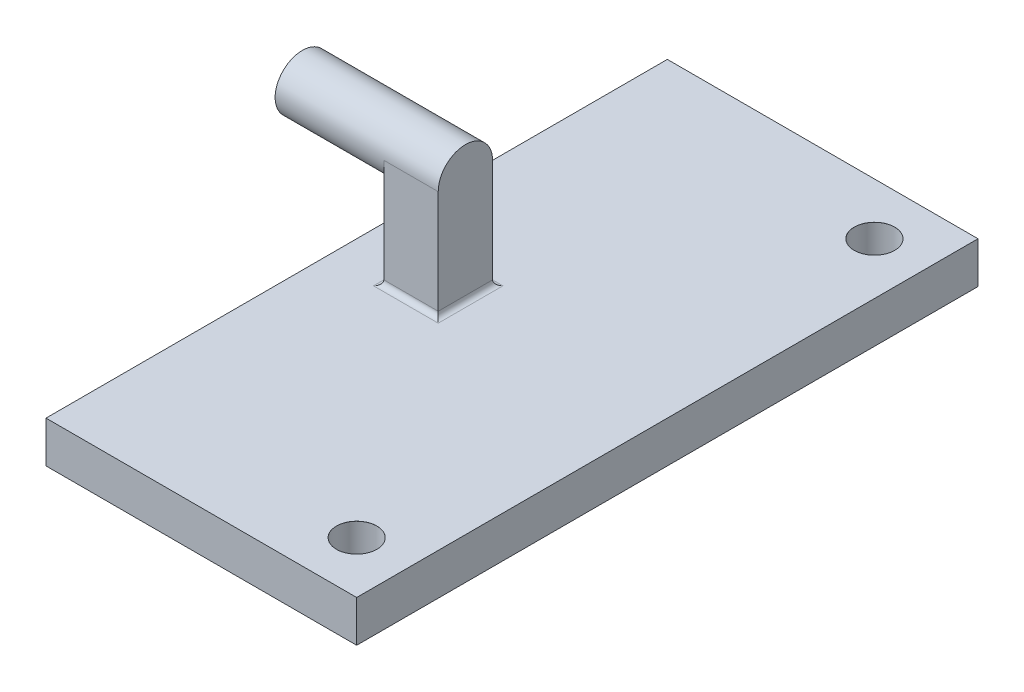
ISO-10303-21;
HEADER;
FILE_DESCRIPTION(('STEP AP214'),'2;1');
FILE_NAME('part.step','',(''),(''),'','','');
FILE_SCHEMA(('AUTOMOTIVE_DESIGN { 1 0 10303 214 1 1 1 1 }'));
ENDSEC;
DATA;
#1=APPLICATION_CONTEXT('core data for automotive mechanical design processes');
#2=APPLICATION_PROTOCOL_DEFINITION('international standard','automotive_design',2000,#1);
#3=PRODUCT_CONTEXT('',#1,'mechanical');
#4=PRODUCT('Part','Part','',(#3));
#5=PRODUCT_RELATED_PRODUCT_CATEGORY('part','',(#4));
#6=PRODUCT_DEFINITION_FORMATION('','',#4);
#7=PRODUCT_DEFINITION_CONTEXT('part definition',#1,'design');
#8=PRODUCT_DEFINITION('design','',#6,#7);
#9=PRODUCT_DEFINITION_SHAPE('','',#8);
#10=(LENGTH_UNIT() NAMED_UNIT(*) SI_UNIT(.MILLI.,.METRE.));
#11=(NAMED_UNIT(*) PLANE_ANGLE_UNIT() SI_UNIT($,.RADIAN.));
#12=(NAMED_UNIT(*) SI_UNIT($,.STERADIAN.) SOLID_ANGLE_UNIT());
#13=UNCERTAINTY_MEASURE_WITH_UNIT(LENGTH_MEASURE(1.E-05),#10,'distance_accuracy_value','');
#14=(GEOMETRIC_REPRESENTATION_CONTEXT(3) GLOBAL_UNCERTAINTY_ASSIGNED_CONTEXT((#13)) GLOBAL_UNIT_ASSIGNED_CONTEXT((#10,
#11,#12)) REPRESENTATION_CONTEXT('',''));
#15=CARTESIAN_POINT('',(0.,0.,0.));
#16=DIRECTION('',(0.,0.,1.));
#17=DIRECTION('',(1.,0.,0.));
#18=AXIS2_PLACEMENT_3D('',#15,#16,#17);
#19=CARTESIAN_POINT('',(105.,0.,0.));
#20=DIRECTION('',(-1.,0.,0.));
#21=DIRECTION('',(0.,0.,1.));
#22=AXIS2_PLACEMENT_3D('',#19,#20,#21);
#23=CYLINDRICAL_SURFACE('',#22,26.25);
#24=CARTESIAN_POINT('',(105.,0.,0.));
#25=DIRECTION('',(1.,0.,0.));
#26=DIRECTION('',(0.,0.,-1.));
#27=AXIS2_PLACEMENT_3D('',#24,#25,#26);
#28=CIRCLE('',#27,26.25);
#29=CARTESIAN_POINT('',(105.,0.,26.25));
#30=VERTEX_POINT('',#29);
#31=CARTESIAN_POINT('',(105.,0.,-26.25));
#32=VERTEX_POINT('',#31);
#33=EDGE_CURVE('E223',#30,#32,#28,.T.);
#34=ORIENTED_EDGE('',*,*,#33,.F.);
#35=DIRECTION('',(-1.,0.,0.));
#36=VECTOR('',#35,1.);
#37=CARTESIAN_POINT('',(157.5,0.,26.25));
#38=LINE('',#37,#36);
#39=CARTESIAN_POINT('',(157.5,0.,26.25));
#40=VERTEX_POINT('',#39);
#41=EDGE_CURVE('E218',#40,#30,#38,.T.);
#42=ORIENTED_EDGE('',*,*,#41,.F.);
#43=CARTESIAN_POINT('',(157.5,0.,0.));
#44=DIRECTION('',(1.,0.,0.));
#45=DIRECTION('',(0.,0.,1.));
#46=AXIS2_PLACEMENT_3D('',#43,#44,#45);
#47=CIRCLE('',#46,26.25);
#48=CARTESIAN_POINT('',(157.5,0.,-26.25));
#49=VERTEX_POINT('',#48);
#50=EDGE_CURVE('E198',#49,#40,#47,.T.);
#51=ORIENTED_EDGE('',*,*,#50,.F.);
#52=DIRECTION('',(-1.,0.,0.));
#53=VECTOR('',#52,1.);
#54=CARTESIAN_POINT('',(157.5,0.,-26.25));
#55=LINE('',#54,#53);
#56=EDGE_CURVE('E210',#49,#32,#55,.T.);
#57=ORIENTED_EDGE('',*,*,#56,.T.);
#58=EDGE_LOOP('',(#34,#42,#51,#57));
#59=FACE_BOUND('',#58,.T.);
#60=CARTESIAN_POINT('',(0.,0.,0.));
#61=DIRECTION('',(1.,0.,0.));
#62=DIRECTION('',(0.,0.,-1.));
#63=AXIS2_PLACEMENT_3D('',#60,#61,#62);
#64=CIRCLE('',#63,26.25);
#65=CARTESIAN_POINT('',(0.,0.,-26.25));
#66=VERTEX_POINT('',#65);
#67=EDGE_CURVE('E222',#66,#66,#64,.T.);
#68=ORIENTED_EDGE('',*,*,#67,.T.);
#69=EDGE_LOOP('',(#68));
#70=FACE_BOUND('',#69,.T.);
#71=ADVANCED_FACE('F45',(#59,#70),#23,.T.);
#72=CARTESIAN_POINT('',(0.,0.,0.));
#73=DIRECTION('',(1.,0.,0.));
#74=DIRECTION('',(0.,0.,-1.));
#75=AXIS2_PLACEMENT_3D('',#72,#73,#74);
#76=PLANE('',#75);
#77=CARTESIAN_POINT('',(0.,0.,0.));
#78=DIRECTION('',(-1.,0.,0.));
#79=DIRECTION('',(0.,0.,1.));
#80=AXIS2_PLACEMENT_3D('',#77,#78,#79);
#81=CIRCLE('',#80,11.025);
#82=CARTESIAN_POINT('',(0.,0.,11.025));
#83=VERTEX_POINT('',#82);
#84=EDGE_CURVE('E180',#83,#83,#81,.T.);
#85=ORIENTED_EDGE('',*,*,#84,.F.);
#86=EDGE_LOOP('',(#85));
#87=FACE_BOUND('',#86,.T.);
#88=ORIENTED_EDGE('',*,*,#67,.F.);
#89=EDGE_LOOP('',(#88));
#90=FACE_BOUND('',#89,.T.);
#91=ADVANCED_FACE('F306',(#87,#90),#76,.F.);
#92=CARTESIAN_POINT('',(157.5,0.,26.25));
#93=DIRECTION('',(0.,0.,-1.));
#94=DIRECTION('',(-1.,0.,0.));
#95=AXIS2_PLACEMENT_3D('',#92,#93,#94);
#96=PLANE('',#95);
#97=DIRECTION('',(0.,-1.,0.));
#98=VECTOR('',#97,1.);
#99=CARTESIAN_POINT('',(105.,0.,26.25));
#100=LINE('',#99,#98);
#101=CARTESIAN_POINT('',(105.,-100.,26.25));
#102=VERTEX_POINT('',#101);
#103=EDGE_CURVE('E197',#30,#102,#100,.T.);
#104=ORIENTED_EDGE('',*,*,#103,.T.);
#105=DIRECTION('',(-1.,0.,0.));
#106=VECTOR('',#105,1.);
#107=CARTESIAN_POINT('',(157.5,-100.,26.25));
#108=LINE('',#107,#106);
#109=CARTESIAN_POINT('',(157.5,-100.,26.25));
#110=VERTEX_POINT('',#109);
#111=EDGE_CURVE('E11',#102,#110,#108,.F.);
#112=ORIENTED_EDGE('',*,*,#111,.T.);
#113=DIRECTION('',(0.,-1.,0.));
#114=VECTOR('',#113,1.);
#115=CARTESIAN_POINT('',(157.5,0.,26.25));
#116=LINE('',#115,#114);
#117=EDGE_CURVE('E202',#40,#110,#116,.T.);
#118=ORIENTED_EDGE('',*,*,#117,.F.);
#119=ORIENTED_EDGE('',*,*,#41,.T.);
#120=EDGE_LOOP('',(#104,#112,#118,#119));
#121=FACE_BOUND('',#120,.T.);
#122=ADVANCED_FACE('F290',(#121),#96,.F.);
#123=CARTESIAN_POINT('',(157.5,-105.,-26.25));
#124=DIRECTION('',(0.,0.,1.));
#125=DIRECTION('',(1.,0.,0.));
#126=AXIS2_PLACEMENT_3D('',#123,#124,#125);
#127=PLANE('',#126);
#128=DIRECTION('',(0.,1.,0.));
#129=VECTOR('',#128,1.);
#130=CARTESIAN_POINT('',(157.5,-105.,-26.25));
#131=LINE('',#130,#129);
#132=CARTESIAN_POINT('',(157.5,-100.,-26.25));
#133=VERTEX_POINT('',#132);
#134=EDGE_CURVE('E207',#133,#49,#131,.T.);
#135=ORIENTED_EDGE('',*,*,#134,.F.);
#136=DIRECTION('',(-1.,0.,0.));
#137=VECTOR('',#136,1.);
#138=CARTESIAN_POINT('',(157.5,-100.,-26.25));
#139=LINE('',#138,#137);
#140=CARTESIAN_POINT('',(105.,-100.,-26.25));
#141=VERTEX_POINT('',#140);
#142=EDGE_CURVE('E70',#133,#141,#139,.T.);
#143=ORIENTED_EDGE('',*,*,#142,.T.);
#144=DIRECTION('',(0.,1.,0.));
#145=VECTOR('',#144,1.);
#146=CARTESIAN_POINT('',(105.,-105.,-26.25));
#147=LINE('',#146,#145);
#148=EDGE_CURVE('E203',#141,#32,#147,.T.);
#149=ORIENTED_EDGE('',*,*,#148,.T.);
#150=ORIENTED_EDGE('',*,*,#56,.F.);
#151=EDGE_LOOP('',(#135,#143,#149,#150));
#152=FACE_BOUND('',#151,.T.);
#153=ADVANCED_FACE('F284',(#152),#127,.F.);
#154=CARTESIAN_POINT('',(157.5,0.,0.));
#155=DIRECTION('',(-1.,0.,0.));
#156=DIRECTION('',(0.,0.,1.));
#157=AXIS2_PLACEMENT_3D('',#154,#155,#156);
#158=PLANE('',#157);
#159=ORIENTED_EDGE('',*,*,#117,.T.);
#160=DIRECTION('',(0.,0.,-1.));
#161=VECTOR('',#160,1.);
#162=CARTESIAN_POINT('',(157.5,-100.,0.));
#163=LINE('',#162,#161);
#164=EDGE_CURVE('E227',#110,#133,#163,.T.);
#165=ORIENTED_EDGE('',*,*,#164,.T.);
#166=ORIENTED_EDGE('',*,*,#134,.T.);
#167=ORIENTED_EDGE('',*,*,#50,.T.);
#168=EDGE_LOOP('',(#159,#165,#166,#167));
#169=FACE_BOUND('',#168,.T.);
#170=ADVANCED_FACE('F282',(#169),#158,.F.);
#171=CARTESIAN_POINT('',(105.,0.,0.));
#172=DIRECTION('',(-1.,0.,0.));
#173=DIRECTION('',(0.,0.,1.));
#174=AXIS2_PLACEMENT_3D('',#171,#172,#173);
#175=PLANE('',#174);
#176=ORIENTED_EDGE('',*,*,#148,.F.);
#177=DIRECTION('',(0.,0.,-1.));
#178=VECTOR('',#177,1.);
#179=CARTESIAN_POINT('',(105.,-100.,26.25));
#180=LINE('',#179,#178);
#181=EDGE_CURVE('E55',#141,#102,#180,.F.);
#182=ORIENTED_EDGE('',*,*,#181,.T.);
#183=ORIENTED_EDGE('',*,*,#103,.F.);
#184=ORIENTED_EDGE('',*,*,#33,.T.);
#185=EDGE_LOOP('',(#176,#182,#183,#184));
#186=FACE_BOUND('',#185,.T.);
#187=ADVANCED_FACE('F291',(#186),#175,.T.);
#188=CARTESIAN_POINT('',(105.,0.,0.));
#189=DIRECTION('',(-1.,0.,0.));
#190=DIRECTION('',(0.,0.,1.));
#191=AXIS2_PLACEMENT_3D('',#188,#189,#190);
#192=CONICAL_SURFACE('',#191,11.,1.02974425867665);
#193=CARTESIAN_POINT('',(111.609466809303,0.,0.));
#194=VERTEX_POINT('',#193);
#195=VERTEX_LOOP('',#194);
#196=FACE_BOUND('',#195,.T.);
#197=CARTESIAN_POINT('',(105.,0.,0.));
#198=DIRECTION('',(-1.,0.,0.));
#199=DIRECTION('',(0.,0.,1.));
#200=AXIS2_PLACEMENT_3D('',#197,#198,#199);
#201=CIRCLE('',#200,11.);
#202=CARTESIAN_POINT('',(105.,0.,11.));
#203=VERTEX_POINT('',#202);
#204=EDGE_CURVE('E193',#203,#203,#201,.T.);
#205=ORIENTED_EDGE('',*,*,#204,.T.);
#206=EDGE_LOOP('',(#205));
#207=FACE_BOUND('',#206,.T.);
#208=ADVANCED_FACE('F293',(#196,#207),#192,.F.);
#209=CARTESIAN_POINT('',(0.,0.,0.));
#210=DIRECTION('',(-1.,0.,0.));
#211=DIRECTION('',(0.,0.,1.));
#212=AXIS2_PLACEMENT_3D('',#209,#210,#211);
#213=CYLINDRICAL_SURFACE('',#212,11.);
#214=ORIENTED_EDGE('',*,*,#204,.F.);
#215=EDGE_LOOP('',(#214));
#216=FACE_BOUND('',#215,.T.);
#217=CARTESIAN_POINT('',(0.0249999999999972,0.,0.));
#218=DIRECTION('',(-1.,0.,0.));
#219=DIRECTION('',(0.,0.,1.));
#220=AXIS2_PLACEMENT_3D('',#217,#218,#219);
#221=CIRCLE('',#220,11.);
#222=CARTESIAN_POINT('',(0.0249999999999972,0.,11.));
#223=VERTEX_POINT('',#222);
#224=EDGE_CURVE('E189',#223,#223,#221,.T.);
#225=ORIENTED_EDGE('',*,*,#224,.T.);
#226=EDGE_LOOP('',(#225));
#227=FACE_BOUND('',#226,.T.);
#228=ADVANCED_FACE('F300',(#216,#227),#213,.F.);
#229=CARTESIAN_POINT('',(0.,0.,0.));
#230=DIRECTION('',(-1.,0.,0.));
#231=DIRECTION('',(0.,0.,1.));
#232=AXIS2_PLACEMENT_3D('',#229,#230,#231);
#233=CONICAL_SURFACE('',#232,11.025,0.785398163397882);
#234=ORIENTED_EDGE('',*,*,#224,.F.);
#235=EDGE_LOOP('',(#234));
#236=FACE_BOUND('',#235,.T.);
#237=ORIENTED_EDGE('',*,*,#84,.T.);
#238=EDGE_LOOP('',(#237));
#239=FACE_BOUND('',#238,.T.);
#240=ADVANCED_FACE('F340',(#236,#239),#233,.F.);
#241=CARTESIAN_POINT('',(52.5,-145.,0.));
#242=DIRECTION('',(1.,0.,0.));
#243=DIRECTION('',(0.,0.,-1.));
#244=AXIS2_PLACEMENT_3D('',#241,#242,#243);
#245=PLANE('',#244);
#246=DIRECTION('',(0.,0.,-1.));
#247=VECTOR('',#246,1.);
#248=CARTESIAN_POINT('',(52.5,-105.,0.));
#249=LINE('',#248,#247);
#250=CARTESIAN_POINT('',(52.5,-105.,300.));
#251=VERTEX_POINT('',#250);
#252=CARTESIAN_POINT('',(52.5000000000002,-105.,-300.));
#253=VERTEX_POINT('',#252);
#254=EDGE_CURVE('E156',#251,#253,#249,.T.);
#255=ORIENTED_EDGE('',*,*,#254,.T.);
#256=DIRECTION('',(0.,1.,0.));
#257=VECTOR('',#256,1.);
#258=CARTESIAN_POINT('',(52.5000000000002,-145.,-300.));
#259=LINE('',#258,#257);
#260=CARTESIAN_POINT('',(52.5000000000002,-145.,-300.));
#261=VERTEX_POINT('',#260);
#262=EDGE_CURVE('E153',#261,#253,#259,.T.);
#263=ORIENTED_EDGE('',*,*,#262,.F.);
#264=DIRECTION('',(0.,0.,1.));
#265=VECTOR('',#264,1.);
#266=CARTESIAN_POINT('',(52.5,-145.,0.));
#267=LINE('',#266,#265);
#268=CARTESIAN_POINT('',(52.5,-145.,300.));
#269=VERTEX_POINT('',#268);
#270=EDGE_CURVE('E146',#261,#269,#267,.T.);
#271=ORIENTED_EDGE('',*,*,#270,.T.);
#272=DIRECTION('',(0.,1.,0.));
#273=VECTOR('',#272,1.);
#274=CARTESIAN_POINT('',(52.5,-145.,300.));
#275=LINE('',#274,#273);
#276=EDGE_CURVE('E129',#269,#251,#275,.T.);
#277=ORIENTED_EDGE('',*,*,#276,.T.);
#278=EDGE_LOOP('',(#255,#263,#271,#277));
#279=FACE_BOUND('',#278,.T.);
#280=ADVANCED_FACE('F152',(#279),#245,.F.);
#281=CARTESIAN_POINT('',(352.5,-145.,-300.));
#282=DIRECTION('',(0.,0.,-1.));
#283=DIRECTION('',(-1.,0.,0.));
#284=AXIS2_PLACEMENT_3D('',#281,#282,#283);
#285=PLANE('',#284);
#286=DIRECTION('',(-1.,0.,0.));
#287=VECTOR('',#286,1.);
#288=CARTESIAN_POINT('',(352.5,-105.,-300.));
#289=LINE('',#288,#287);
#290=CARTESIAN_POINT('',(352.5,-105.,-300.));
#291=VERTEX_POINT('',#290);
#292=EDGE_CURVE('E159',#291,#253,#289,.T.);
#293=ORIENTED_EDGE('',*,*,#292,.F.);
#294=DIRECTION('',(0.,1.,0.));
#295=VECTOR('',#294,1.);
#296=CARTESIAN_POINT('',(352.5,-145.,-300.));
#297=LINE('',#296,#295);
#298=CARTESIAN_POINT('',(352.5,-145.,-300.));
#299=VERTEX_POINT('',#298);
#300=EDGE_CURVE('E181',#299,#291,#297,.T.);
#301=ORIENTED_EDGE('',*,*,#300,.F.);
#302=DIRECTION('',(-1.,0.,0.));
#303=VECTOR('',#302,1.);
#304=CARTESIAN_POINT('',(352.5,-145.,-300.));
#305=LINE('',#304,#303);
#306=EDGE_CURVE('E140',#299,#261,#305,.T.);
#307=ORIENTED_EDGE('',*,*,#306,.T.);
#308=ORIENTED_EDGE('',*,*,#262,.T.);
#309=EDGE_LOOP('',(#293,#301,#307,#308));
#310=FACE_BOUND('',#309,.T.);
#311=ADVANCED_FACE('F339',(#310),#285,.T.);
#312=CARTESIAN_POINT('',(352.5,-145.,300.));
#313=DIRECTION('',(1.,0.,0.));
#314=DIRECTION('',(0.,0.,-1.));
#315=AXIS2_PLACEMENT_3D('',#312,#313,#314);
#316=PLANE('',#315);
#317=DIRECTION('',(0.,0.,-1.));
#318=VECTOR('',#317,1.);
#319=CARTESIAN_POINT('',(352.5,-105.,300.));
#320=LINE('',#319,#318);
#321=CARTESIAN_POINT('',(352.5,-105.,300.));
#322=VERTEX_POINT('',#321);
#323=EDGE_CURVE('E171',#322,#291,#320,.T.);
#324=ORIENTED_EDGE('',*,*,#323,.F.);
#325=DIRECTION('',(0.,1.,0.));
#326=VECTOR('',#325,1.);
#327=CARTESIAN_POINT('',(352.5,-145.,300.));
#328=LINE('',#327,#326);
#329=CARTESIAN_POINT('',(352.5,-145.,300.));
#330=VERTEX_POINT('',#329);
#331=EDGE_CURVE('E139',#330,#322,#328,.T.);
#332=ORIENTED_EDGE('',*,*,#331,.F.);
#333=DIRECTION('',(0.,0.,-1.));
#334=VECTOR('',#333,1.);
#335=CARTESIAN_POINT('',(352.5,-145.,300.));
#336=LINE('',#335,#334);
#337=EDGE_CURVE('E149',#330,#299,#336,.T.);
#338=ORIENTED_EDGE('',*,*,#337,.T.);
#339=ORIENTED_EDGE('',*,*,#300,.T.);
#340=EDGE_LOOP('',(#324,#332,#338,#339));
#341=FACE_BOUND('',#340,.T.);
#342=ADVANCED_FACE('F343',(#341),#316,.T.);
#343=CARTESIAN_POINT('',(52.5,-145.,300.));
#344=DIRECTION('',(0.,0.,1.));
#345=DIRECTION('',(1.,0.,0.));
#346=AXIS2_PLACEMENT_3D('',#343,#344,#345);
#347=PLANE('',#346);
#348=DIRECTION('',(1.,0.,0.));
#349=VECTOR('',#348,1.);
#350=CARTESIAN_POINT('',(52.5,-105.,300.));
#351=LINE('',#350,#349);
#352=EDGE_CURVE('E134',#251,#322,#351,.T.);
#353=ORIENTED_EDGE('',*,*,#352,.F.);
#354=ORIENTED_EDGE('',*,*,#276,.F.);
#355=DIRECTION('',(1.,0.,0.));
#356=VECTOR('',#355,1.);
#357=CARTESIAN_POINT('',(52.5,-145.,300.));
#358=LINE('',#357,#356);
#359=EDGE_CURVE('E132',#269,#330,#358,.T.);
#360=ORIENTED_EDGE('',*,*,#359,.T.);
#361=ORIENTED_EDGE('',*,*,#331,.T.);
#362=EDGE_LOOP('',(#353,#354,#360,#361));
#363=FACE_BOUND('',#362,.T.);
#364=ADVANCED_FACE('F131',(#363),#347,.T.);
#365=CARTESIAN_POINT('',(0.,-145.,0.));
#366=DIRECTION('',(0.,1.,0.));
#367=DIRECTION('',(0.,0.,1.));
#368=AXIS2_PLACEMENT_3D('',#365,#366,#367);
#369=PLANE('',#368);
#370=CARTESIAN_POINT('',(302.5,-145.,250.));
#371=DIRECTION('',(0.,1.,0.));
#372=DIRECTION('',(0.,0.,1.));
#373=AXIS2_PLACEMENT_3D('',#370,#371,#372);
#374=CIRCLE('',#373,19.5);
#375=CARTESIAN_POINT('',(302.5,-145.,269.5));
#376=VERTEX_POINT('',#375);
#377=EDGE_CURVE('E503',#376,#376,#374,.T.);
#378=ORIENTED_EDGE('',*,*,#377,.T.);
#379=EDGE_LOOP('',(#378));
#380=FACE_BOUND('',#379,.T.);
#381=CARTESIAN_POINT('',(302.5,-145.,-250.));
#382=DIRECTION('',(0.,1.,0.));
#383=DIRECTION('',(0.,0.,1.));
#384=AXIS2_PLACEMENT_3D('',#381,#382,#383);
#385=CIRCLE('',#384,19.5);
#386=CARTESIAN_POINT('',(302.5,-145.,-230.5));
#387=VERTEX_POINT('',#386);
#388=EDGE_CURVE('E162',#387,#387,#385,.T.);
#389=ORIENTED_EDGE('',*,*,#388,.T.);
#390=EDGE_LOOP('',(#389));
#391=FACE_BOUND('',#390,.T.);
#392=ORIENTED_EDGE('',*,*,#270,.F.);
#393=ORIENTED_EDGE('',*,*,#306,.F.);
#394=ORIENTED_EDGE('',*,*,#337,.F.);
#395=ORIENTED_EDGE('',*,*,#359,.F.);
#396=EDGE_LOOP('',(#392,#393,#394,#395));
#397=FACE_BOUND('',#396,.T.);
#398=ADVANCED_FACE('F144',(#380,#391,#397),#369,.F.);
#399=CARTESIAN_POINT('',(0.,-105.,0.));
#400=DIRECTION('',(0.,1.,0.));
#401=DIRECTION('',(0.,0.,1.));
#402=AXIS2_PLACEMENT_3D('',#399,#400,#401);
#403=PLANE('',#402);
#404=CARTESIAN_POINT('',(302.5,-105.,250.));
#405=DIRECTION('',(0.,1.,0.));
#406=DIRECTION('',(0.,0.,1.));
#407=AXIS2_PLACEMENT_3D('',#404,#405,#406);
#408=CIRCLE('',#407,19.525);
#409=CARTESIAN_POINT('',(302.5,-105.,269.525));
#410=VERTEX_POINT('',#409);
#411=EDGE_CURVE('E499',#410,#410,#408,.T.);
#412=ORIENTED_EDGE('',*,*,#411,.F.);
#413=EDGE_LOOP('',(#412));
#414=FACE_BOUND('',#413,.T.);
#415=CARTESIAN_POINT('',(302.5,-105.,-250.));
#416=DIRECTION('',(0.,1.,0.));
#417=DIRECTION('',(0.,0.,1.));
#418=AXIS2_PLACEMENT_3D('',#415,#416,#417);
#419=CIRCLE('',#418,19.525);
#420=CARTESIAN_POINT('',(302.5,-105.,-230.475));
#421=VERTEX_POINT('',#420);
#422=EDGE_CURVE('E509',#421,#421,#419,.T.);
#423=ORIENTED_EDGE('',*,*,#422,.F.);
#424=EDGE_LOOP('',(#423));
#425=FACE_BOUND('',#424,.T.);
#426=DIRECTION('',(-1.,0.,0.));
#427=VECTOR('',#426,1.);
#428=CARTESIAN_POINT('',(0.,-105.,-31.25));
#429=LINE('',#428,#427);
#430=CARTESIAN_POINT('',(100.,-105.,-31.25));
#431=VERTEX_POINT('',#430);
#432=CARTESIAN_POINT('',(162.5,-105.,-31.25));
#433=VERTEX_POINT('',#432);
#434=EDGE_CURVE('E240',#431,#433,#429,.F.);
#435=ORIENTED_EDGE('',*,*,#434,.T.);
#436=DIRECTION('',(0.,0.,-1.));
#437=VECTOR('',#436,1.);
#438=CARTESIAN_POINT('',(162.5,-105.,0.));
#439=LINE('',#438,#437);
#440=CARTESIAN_POINT('',(162.5,-105.,31.25));
#441=VERTEX_POINT('',#440);
#442=EDGE_CURVE('E243',#433,#441,#439,.F.);
#443=ORIENTED_EDGE('',*,*,#442,.T.);
#444=DIRECTION('',(-1.,0.,0.));
#445=VECTOR('',#444,1.);
#446=CARTESIAN_POINT('',(0.,-105.,31.25));
#447=LINE('',#446,#445);
#448=CARTESIAN_POINT('',(100.,-105.,31.25));
#449=VERTEX_POINT('',#448);
#450=EDGE_CURVE('E234',#441,#449,#447,.T.);
#451=ORIENTED_EDGE('',*,*,#450,.T.);
#452=DIRECTION('',(0.,0.,-1.));
#453=VECTOR('',#452,1.);
#454=CARTESIAN_POINT('',(100.,-105.,-26.25));
#455=LINE('',#454,#453);
#456=EDGE_CURVE('E237',#449,#431,#455,.T.);
#457=ORIENTED_EDGE('',*,*,#456,.T.);
#458=EDGE_LOOP('',(#435,#443,#451,#457));
#459=FACE_BOUND('',#458,.T.);
#460=ORIENTED_EDGE('',*,*,#254,.F.);
#461=ORIENTED_EDGE('',*,*,#352,.T.);
#462=ORIENTED_EDGE('',*,*,#323,.T.);
#463=ORIENTED_EDGE('',*,*,#292,.T.);
#464=EDGE_LOOP('',(#460,#461,#462,#463));
#465=FACE_BOUND('',#464,.T.);
#466=ADVANCED_FACE('F273',(#414,#425,#459,#465),#403,.T.);
#467=CARTESIAN_POINT('',(100.,-100.,0.));
#468=DIRECTION('',(0.,0.,1.));
#469=DIRECTION('',(1.,0.,0.));
#470=AXIS2_PLACEMENT_3D('',#467,#468,#469);
#471=CYLINDRICAL_SURFACE('',#470,5.);
#472=CARTESIAN_POINT('',(100.,-100.,-31.25));
#473=DIRECTION('',(-0.707106781186547,0.,0.707106781186547));
#474=DIRECTION('',(0.707106781186547,0.,0.707106781186547));
#475=AXIS2_PLACEMENT_3D('',#472,#473,#474);
#476=ELLIPSE('',#475,7.07106781186547,5.);
#477=EDGE_CURVE('E256',#431,#141,#476,.T.);
#478=ORIENTED_EDGE('',*,*,#477,.F.);
#479=ORIENTED_EDGE('',*,*,#456,.F.);
#480=CARTESIAN_POINT('',(100.,-100.,31.25));
#481=DIRECTION('',(-0.707106781186547,0.,-0.707106781186547));
#482=DIRECTION('',(-0.707106781186547,0.,0.707106781186547));
#483=AXIS2_PLACEMENT_3D('',#480,#481,#482);
#484=ELLIPSE('',#483,7.07106781186547,5.);
#485=EDGE_CURVE('E49',#102,#449,#484,.T.);
#486=ORIENTED_EDGE('',*,*,#485,.F.);
#487=ORIENTED_EDGE('',*,*,#181,.F.);
#488=EDGE_LOOP('',(#478,#479,#486,#487));
#489=FACE_BOUND('',#488,.T.);
#490=ADVANCED_FACE('F47',(#489),#471,.F.);
#491=CARTESIAN_POINT('',(0.,-100.,31.25));
#492=DIRECTION('',(-1.,0.,0.));
#493=DIRECTION('',(0.,0.,1.));
#494=AXIS2_PLACEMENT_3D('',#491,#492,#493);
#495=CYLINDRICAL_SURFACE('',#494,5.);
#496=ORIENTED_EDGE('',*,*,#485,.T.);
#497=ORIENTED_EDGE('',*,*,#450,.F.);
#498=CARTESIAN_POINT('',(162.5,-100.,31.25));
#499=DIRECTION('',(-0.707106781186547,0.,0.707106781186547));
#500=DIRECTION('',(-0.707106781186547,0.,-0.707106781186547));
#501=AXIS2_PLACEMENT_3D('',#498,#499,#500);
#502=ELLIPSE('',#501,7.07106781186547,5.);
#503=EDGE_CURVE('E254',#110,#441,#502,.T.);
#504=ORIENTED_EDGE('',*,*,#503,.F.);
#505=ORIENTED_EDGE('',*,*,#111,.F.);
#506=EDGE_LOOP('',(#496,#497,#504,#505));
#507=FACE_BOUND('',#506,.T.);
#508=ADVANCED_FACE('F268',(#507),#495,.F.);
#509=CARTESIAN_POINT('',(157.5,-100.,-31.25));
#510=DIRECTION('',(-1.,0.,0.));
#511=DIRECTION('',(0.,0.,1.));
#512=AXIS2_PLACEMENT_3D('',#509,#510,#511);
#513=CYLINDRICAL_SURFACE('',#512,5.);
#514=ORIENTED_EDGE('',*,*,#477,.T.);
#515=ORIENTED_EDGE('',*,*,#142,.F.);
#516=CARTESIAN_POINT('',(162.5,-100.,-31.25));
#517=DIRECTION('',(-0.707106781186547,0.,-0.707106781186547));
#518=DIRECTION('',(-0.707106781186547,0.,0.707106781186547));
#519=AXIS2_PLACEMENT_3D('',#516,#517,#518);
#520=ELLIPSE('',#519,7.07106781186547,5.);
#521=EDGE_CURVE('E251',#433,#133,#520,.T.);
#522=ORIENTED_EDGE('',*,*,#521,.F.);
#523=ORIENTED_EDGE('',*,*,#434,.F.);
#524=EDGE_LOOP('',(#514,#515,#522,#523));
#525=FACE_BOUND('',#524,.T.);
#526=ADVANCED_FACE('F280',(#525),#513,.F.);
#527=CARTESIAN_POINT('',(162.5,-100.,0.));
#528=DIRECTION('',(0.,0.,-1.));
#529=DIRECTION('',(-1.,0.,0.));
#530=AXIS2_PLACEMENT_3D('',#527,#528,#529);
#531=CYLINDRICAL_SURFACE('',#530,5.);
#532=ORIENTED_EDGE('',*,*,#503,.T.);
#533=ORIENTED_EDGE('',*,*,#442,.F.);
#534=ORIENTED_EDGE('',*,*,#521,.T.);
#535=ORIENTED_EDGE('',*,*,#164,.F.);
#536=EDGE_LOOP('',(#532,#533,#534,#535));
#537=FACE_BOUND('',#536,.T.);
#538=ADVANCED_FACE('F278',(#537),#531,.F.);
#539=CARTESIAN_POINT('',(302.5,-105.,-250.));
#540=DIRECTION('',(0.,1.,0.));
#541=DIRECTION('',(0.,0.,1.));
#542=AXIS2_PLACEMENT_3D('',#539,#540,#541);
#543=CYLINDRICAL_SURFACE('',#542,19.5);
#544=ORIENTED_EDGE('',*,*,#388,.F.);
#545=EDGE_LOOP('',(#544));
#546=FACE_BOUND('',#545,.T.);
#547=CARTESIAN_POINT('',(302.5,-105.025,-250.));
#548=DIRECTION('',(0.,1.,0.));
#549=DIRECTION('',(0.,0.,1.));
#550=AXIS2_PLACEMENT_3D('',#547,#548,#549);
#551=CIRCLE('',#550,19.5);
#552=CARTESIAN_POINT('',(302.5,-105.025,-230.5));
#553=VERTEX_POINT('',#552);
#554=EDGE_CURVE('E512',#553,#553,#551,.T.);
#555=ORIENTED_EDGE('',*,*,#554,.T.);
#556=EDGE_LOOP('',(#555));
#557=FACE_BOUND('',#556,.T.);
#558=ADVANCED_FACE('F317',(#546,#557),#543,.F.);
#559=CARTESIAN_POINT('',(302.5,-105.,-250.));
#560=DIRECTION('',(0.,1.,0.));
#561=DIRECTION('',(0.,0.,1.));
#562=AXIS2_PLACEMENT_3D('',#559,#560,#561);
#563=CONICAL_SURFACE('',#562,19.525,0.785398163397171);
#564=ORIENTED_EDGE('',*,*,#554,.F.);
#565=EDGE_LOOP('',(#564));
#566=FACE_BOUND('',#565,.T.);
#567=ORIENTED_EDGE('',*,*,#422,.T.);
#568=EDGE_LOOP('',(#567));
#569=FACE_BOUND('',#568,.T.);
#570=ADVANCED_FACE('F461',(#566,#569),#563,.F.);
#571=CARTESIAN_POINT('',(302.5,-105.,250.));
#572=DIRECTION('',(0.,1.,0.));
#573=DIRECTION('',(0.,0.,1.));
#574=AXIS2_PLACEMENT_3D('',#571,#572,#573);
#575=CYLINDRICAL_SURFACE('',#574,19.5);
#576=ORIENTED_EDGE('',*,*,#377,.F.);
#577=EDGE_LOOP('',(#576));
#578=FACE_BOUND('',#577,.T.);
#579=CARTESIAN_POINT('',(302.5,-105.025,250.));
#580=DIRECTION('',(0.,1.,0.));
#581=DIRECTION('',(0.,0.,1.));
#582=AXIS2_PLACEMENT_3D('',#579,#580,#581);
#583=CIRCLE('',#582,19.5);
#584=CARTESIAN_POINT('',(302.5,-105.025,269.5));
#585=VERTEX_POINT('',#584);
#586=EDGE_CURVE('E497',#585,#585,#583,.T.);
#587=ORIENTED_EDGE('',*,*,#586,.T.);
#588=EDGE_LOOP('',(#587));
#589=FACE_BOUND('',#588,.T.);
#590=ADVANCED_FACE('F469',(#578,#589),#575,.F.);
#591=CARTESIAN_POINT('',(302.5,-105.,250.));
#592=DIRECTION('',(0.,1.,0.));
#593=DIRECTION('',(0.,0.,1.));
#594=AXIS2_PLACEMENT_3D('',#591,#592,#593);
#595=CONICAL_SURFACE('',#594,19.525,0.785398163397171);
#596=ORIENTED_EDGE('',*,*,#586,.F.);
#597=EDGE_LOOP('',(#596));
#598=FACE_BOUND('',#597,.T.);
#599=ORIENTED_EDGE('',*,*,#411,.T.);
#600=EDGE_LOOP('',(#599));
#601=FACE_BOUND('',#600,.T.);
#602=ADVANCED_FACE('F478',(#598,#601),#595,.F.);
#603=CLOSED_SHELL('',(#71,#91,#122,#153,#170,#187,#208,#228,#240,#280,#311,#342,#364,#398,#466,
#490,#508,#526,#538,#558,#570,#590,#602));
#604=MANIFOLD_SOLID_BREP('B2',#603);
#605=ADVANCED_BREP_SHAPE_REPRESENTATION('',(#18,#604),#14);
#606=SHAPE_DEFINITION_REPRESENTATION(#9,#605);
ENDSEC;
END-ISO-10303-21;
